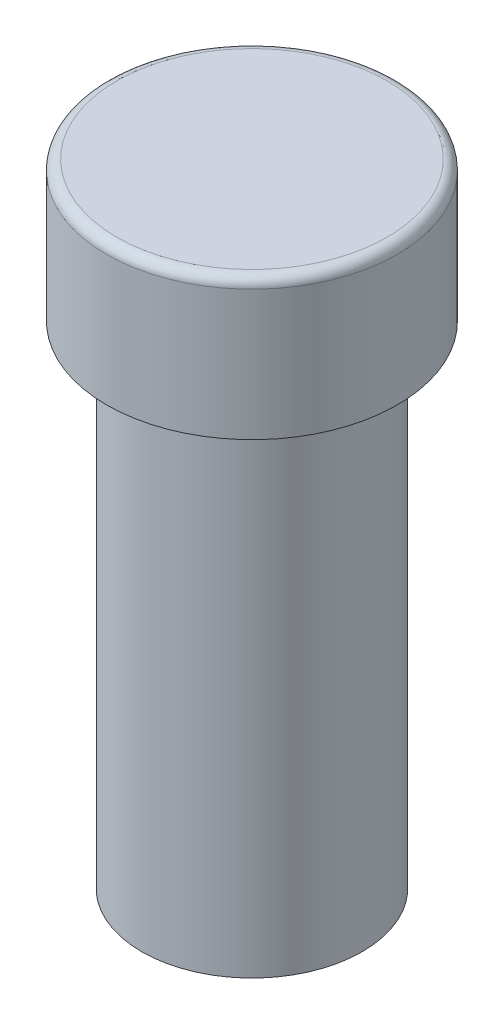
ISO-10303-21;
HEADER;
FILE_DESCRIPTION(('STEP AP214'),'2;1');
FILE_NAME('part.step','',(''),(''),'','','');
FILE_SCHEMA(('AUTOMOTIVE_DESIGN { 1 0 10303 214 1 1 1 1 }'));
ENDSEC;
DATA;
#1=APPLICATION_CONTEXT('core data for automotive mechanical design processes');
#2=APPLICATION_PROTOCOL_DEFINITION('international standard','automotive_design',2000,#1);
#3=PRODUCT_CONTEXT('',#1,'mechanical');
#4=PRODUCT('Part','Part','',(#3));
#5=PRODUCT_RELATED_PRODUCT_CATEGORY('part','',(#4));
#6=PRODUCT_DEFINITION_FORMATION('','',#4);
#7=PRODUCT_DEFINITION_CONTEXT('part definition',#1,'design');
#8=PRODUCT_DEFINITION('design','',#6,#7);
#9=PRODUCT_DEFINITION_SHAPE('','',#8);
#10=(LENGTH_UNIT() NAMED_UNIT(*) SI_UNIT(.MILLI.,.METRE.));
#11=(NAMED_UNIT(*) PLANE_ANGLE_UNIT() SI_UNIT($,.RADIAN.));
#12=(NAMED_UNIT(*) SI_UNIT($,.STERADIAN.) SOLID_ANGLE_UNIT());
#13=UNCERTAINTY_MEASURE_WITH_UNIT(LENGTH_MEASURE(1.E-05),#10,'distance_accuracy_value','');
#14=(GEOMETRIC_REPRESENTATION_CONTEXT(3) GLOBAL_UNCERTAINTY_ASSIGNED_CONTEXT((#13)) GLOBAL_UNIT_ASSIGNED_CONTEXT((#10,
#11,#12)) REPRESENTATION_CONTEXT('',''));
#15=CARTESIAN_POINT('',(0.,0.,0.));
#16=DIRECTION('',(0.,0.,1.));
#17=DIRECTION('',(1.,0.,0.));
#18=AXIS2_PLACEMENT_3D('',#15,#16,#17);
#19=CARTESIAN_POINT('',(0.,0.,0.));
#20=DIRECTION('',(0.,1.,0.));
#21=DIRECTION('',(0.,0.,1.));
#22=AXIS2_PLACEMENT_3D('',#19,#20,#21);
#23=PLANE('',#22);
#24=CARTESIAN_POINT('',(0.,0.,0.));
#25=DIRECTION('',(0.,1.,0.));
#26=DIRECTION('',(0.,0.,1.));
#27=AXIS2_PLACEMENT_3D('',#24,#25,#26);
#28=CIRCLE('',#27,14.5);
#29=CARTESIAN_POINT('',(0.,0.,14.5));
#30=VERTEX_POINT('',#29);
#31=EDGE_CURVE('E49',#30,#30,#28,.T.);
#32=ORIENTED_EDGE('',*,*,#31,.F.);
#33=EDGE_LOOP('',(#32));
#34=FACE_BOUND('',#33,.T.);
#35=CARTESIAN_POINT('',(0.,0.,0.));
#36=DIRECTION('',(0.,1.,0.));
#37=DIRECTION('',(0.,0.,1.));
#38=AXIS2_PLACEMENT_3D('',#35,#36,#37);
#39=CIRCLE('',#38,11.);
#40=CARTESIAN_POINT('',(0.,0.,11.));
#41=VERTEX_POINT('',#40);
#42=EDGE_CURVE('E45',#41,#41,#39,.F.);
#43=ORIENTED_EDGE('',*,*,#42,.F.);
#44=EDGE_LOOP('',(#43));
#45=FACE_BOUND('',#44,.T.);
#46=ADVANCED_FACE('F34',(#34,#45),#23,.F.);
#47=CARTESIAN_POINT('',(0.,14.,0.));
#48=DIRECTION('',(0.,-1.,0.));
#49=DIRECTION('',(0.,0.,-1.));
#50=AXIS2_PLACEMENT_3D('',#47,#48,#49);
#51=CYLINDRICAL_SURFACE('',#50,14.5);
#52=CARTESIAN_POINT('',(0.,13.,0.));
#53=DIRECTION('',(0.,1.,0.));
#54=DIRECTION('',(0.,0.,1.));
#55=AXIS2_PLACEMENT_3D('',#52,#53,#54);
#56=CIRCLE('',#55,14.5);
#57=CARTESIAN_POINT('',(0.,13.,14.5));
#58=VERTEX_POINT('',#57);
#59=EDGE_CURVE('E11',#58,#58,#56,.F.);
#60=ORIENTED_EDGE('',*,*,#59,.T.);
#61=EDGE_LOOP('',(#60));
#62=FACE_BOUND('',#61,.T.);
#63=ORIENTED_EDGE('',*,*,#31,.T.);
#64=EDGE_LOOP('',(#63));
#65=FACE_BOUND('',#64,.T.);
#66=ADVANCED_FACE('F72',(#62,#65),#51,.T.);
#67=CARTESIAN_POINT('',(0.,14.,0.));
#68=DIRECTION('',(0.,1.,0.));
#69=DIRECTION('',(0.,0.,1.));
#70=AXIS2_PLACEMENT_3D('',#67,#68,#69);
#71=PLANE('',#70);
#72=CARTESIAN_POINT('',(0.,14.,0.));
#73=DIRECTION('',(0.,1.,0.));
#74=DIRECTION('',(0.,0.,1.));
#75=AXIS2_PLACEMENT_3D('',#72,#73,#74);
#76=CIRCLE('',#75,13.5);
#77=CARTESIAN_POINT('',(0.,14.,13.5));
#78=VERTEX_POINT('',#77);
#79=EDGE_CURVE('E41',#78,#78,#76,.T.);
#80=ORIENTED_EDGE('',*,*,#79,.T.);
#81=EDGE_LOOP('',(#80));
#82=FACE_BOUND('',#81,.T.);
#83=ADVANCED_FACE('F69',(#82),#71,.T.);
#84=CARTESIAN_POINT('',(0.,-143.112698372208,0.));
#85=DIRECTION('',(0.,1.,0.));
#86=DIRECTION('',(0.,0.,1.));
#87=AXIS2_PLACEMENT_3D('',#84,#85,#86);
#88=CYLINDRICAL_SURFACE('',#87,11.);
#89=CARTESIAN_POINT('',(0.,-49.,0.));
#90=DIRECTION('',(0.,1.,0.));
#91=DIRECTION('',(0.,0.,1.));
#92=AXIS2_PLACEMENT_3D('',#89,#90,#91);
#93=CIRCLE('',#92,11.);
#94=CARTESIAN_POINT('',(0.,-49.,11.));
#95=VERTEX_POINT('',#94);
#96=EDGE_CURVE('E54',#95,#95,#93,.T.);
#97=ORIENTED_EDGE('',*,*,#96,.T.);
#98=EDGE_LOOP('',(#97));
#99=FACE_BOUND('',#98,.T.);
#100=ORIENTED_EDGE('',*,*,#42,.T.);
#101=EDGE_LOOP('',(#100));
#102=FACE_BOUND('',#101,.T.);
#103=ADVANCED_FACE('F58',(#99,#102),#88,.T.);
#104=CARTESIAN_POINT('',(0.,-49.,0.));
#105=DIRECTION('',(0.,1.,0.));
#106=DIRECTION('',(0.,0.,1.));
#107=AXIS2_PLACEMENT_3D('',#104,#105,#106);
#108=PLANE('',#107);
#109=ORIENTED_EDGE('',*,*,#96,.F.);
#110=EDGE_LOOP('',(#109));
#111=FACE_BOUND('',#110,.T.);
#112=ADVANCED_FACE('F61',(#111),#108,.F.);
#113=CARTESIAN_POINT('',(0.,13.,0.));
#114=DIRECTION('',(0.,1.,0.));
#115=DIRECTION('',(0.,0.,1.));
#116=AXIS2_PLACEMENT_3D('',#113,#114,#115);
#117=TOROIDAL_SURFACE('',#116,13.5,1.);
#118=ORIENTED_EDGE('',*,*,#59,.F.);
#119=EDGE_LOOP('',(#118));
#120=FACE_BOUND('',#119,.T.);
#121=ORIENTED_EDGE('',*,*,#79,.F.);
#122=EDGE_LOOP('',(#121));
#123=FACE_BOUND('',#122,.T.);
#124=ADVANCED_FACE('F36',(#120,#123),#117,.T.);
#125=CLOSED_SHELL('',(#46,#66,#83,#103,#112,#124));
#126=MANIFOLD_SOLID_BREP('B2',#125);
#127=ADVANCED_BREP_SHAPE_REPRESENTATION('',(#18,#126),#14);
#128=SHAPE_DEFINITION_REPRESENTATION(#9,#127);
ENDSEC;
END-ISO-10303-21;
